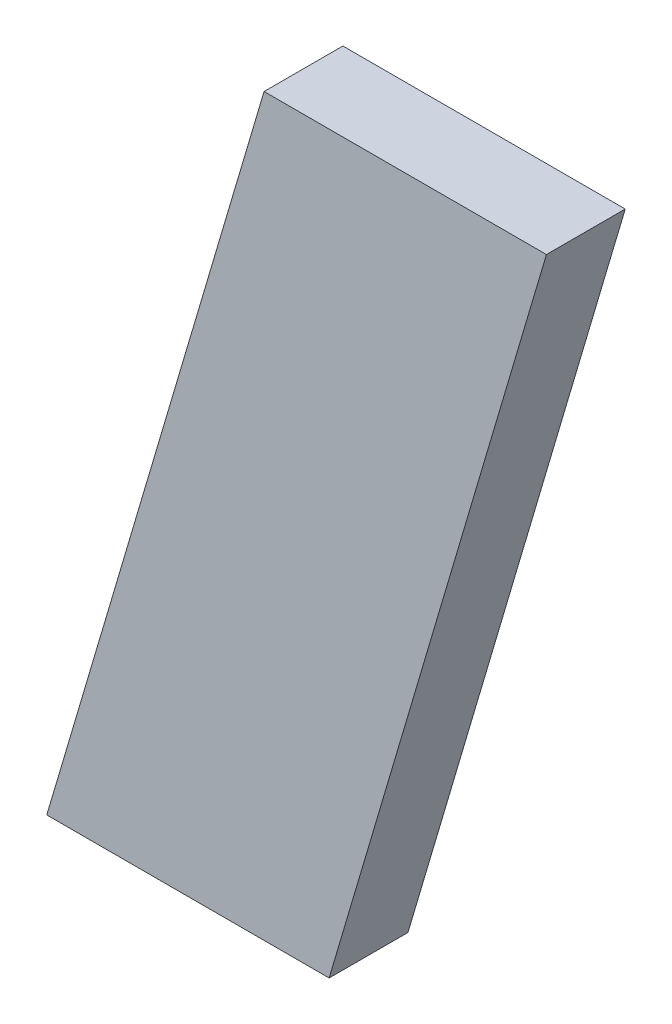
ISO-10303-21;
HEADER;
FILE_DESCRIPTION(('STEP AP214'),'2;1');
FILE_NAME('part.step','',(''),(''),'','','');
FILE_SCHEMA(('AUTOMOTIVE_DESIGN { 1 0 10303 214 1 1 1 1 }'));
ENDSEC;
DATA;
#1=APPLICATION_CONTEXT('core data for automotive mechanical design processes');
#2=APPLICATION_PROTOCOL_DEFINITION('international standard','automotive_design',2000,#1);
#3=PRODUCT_CONTEXT('',#1,'mechanical');
#4=PRODUCT('Part','Part','',(#3));
#5=PRODUCT_RELATED_PRODUCT_CATEGORY('part','',(#4));
#6=PRODUCT_DEFINITION_FORMATION('','',#4);
#7=PRODUCT_DEFINITION_CONTEXT('part definition',#1,'design');
#8=PRODUCT_DEFINITION('design','',#6,#7);
#9=PRODUCT_DEFINITION_SHAPE('','',#8);
#10=(LENGTH_UNIT() NAMED_UNIT(*) SI_UNIT(.MILLI.,.METRE.));
#11=(NAMED_UNIT(*) PLANE_ANGLE_UNIT() SI_UNIT($,.RADIAN.));
#12=(NAMED_UNIT(*) SI_UNIT($,.STERADIAN.) SOLID_ANGLE_UNIT());
#13=UNCERTAINTY_MEASURE_WITH_UNIT(LENGTH_MEASURE(1.E-05),#10,'distance_accuracy_value','');
#14=(GEOMETRIC_REPRESENTATION_CONTEXT(3) GLOBAL_UNCERTAINTY_ASSIGNED_CONTEXT((#13)) GLOBAL_UNIT_ASSIGNED_CONTEXT((#10,
#11,#12)) REPRESENTATION_CONTEXT('',''));
#15=CARTESIAN_POINT('',(0.,0.,0.));
#16=DIRECTION('',(0.,0.,1.));
#17=DIRECTION('',(1.,0.,0.));
#18=AXIS2_PLACEMENT_3D('',#15,#16,#17);
#19=CARTESIAN_POINT('',(-4.324026202271,-7.551976874295,0.));
#20=DIRECTION('',(0.,1.,0.));
#21=DIRECTION('',(-1.,0.,0.));
#22=AXIS2_PLACEMENT_3D('',#19,#20,#21);
#23=PLANE('',#22);
#24=DIRECTION('',(-1.,0.,0.));
#25=VECTOR('',#24,1.);
#26=CARTESIAN_POINT('',(-4.324026202271,-7.551976874295,0.));
#27=LINE('',#26,#25);
#28=CARTESIAN_POINT('',(-4.324026202271,-7.551976874295,0.));
#29=VERTEX_POINT('',#28);
#30=CARTESIAN_POINT('',(-4.682378611228,-7.551976874295,0.));
#31=VERTEX_POINT('',#30);
#32=EDGE_CURVE('E11',#29,#31,#27,.T.);
#33=ORIENTED_EDGE('',*,*,#32,.T.);
#34=DIRECTION('',(0.,0.,1.));
#35=VECTOR('',#34,1.);
#36=CARTESIAN_POINT('',(-4.682378611228,-7.551976874295,0.));
#37=LINE('',#36,#35);
#38=CARTESIAN_POINT('',(-4.682378611228,-7.551976874295,0.1));
#39=VERTEX_POINT('',#38);
#40=EDGE_CURVE('E24',#31,#39,#37,.T.);
#41=ORIENTED_EDGE('',*,*,#40,.T.);
#42=DIRECTION('',(-1.,0.,0.));
#43=VECTOR('',#42,1.);
#44=CARTESIAN_POINT('',(-4.324026202271,-7.551976874295,0.1));
#45=LINE('',#44,#43);
#46=CARTESIAN_POINT('',(-4.324026202271,-7.551976874295,0.1));
#47=VERTEX_POINT('',#46);
#48=EDGE_CURVE('E75',#47,#39,#45,.T.);
#49=ORIENTED_EDGE('',*,*,#48,.F.);
#50=DIRECTION('',(0.,0.,1.));
#51=VECTOR('',#50,1.);
#52=CARTESIAN_POINT('',(-4.324026202271,-7.551976874295,0.));
#53=LINE('',#52,#51);
#54=EDGE_CURVE('E86',#29,#47,#53,.T.);
#55=ORIENTED_EDGE('',*,*,#54,.F.);
#56=EDGE_LOOP('',(#33,#41,#49,#55));
#57=FACE_BOUND('',#56,.T.);
#58=ADVANCED_FACE('F17',(#57),#23,.T.);
#59=CARTESIAN_POINT('',(-4.599774339594,-8.484987758415,0.));
#60=DIRECTION('',(0.958993732012228,-0.283427278082509,0.));
#61=DIRECTION('',(0.283427278082509,0.958993732012228,0.));
#62=AXIS2_PLACEMENT_3D('',#59,#60,#61);
#63=PLANE('',#62);
#64=DIRECTION('',(0.283427278082509,0.958993732012228,0.));
#65=VECTOR('',#64,1.);
#66=CARTESIAN_POINT('',(-4.599774339594,-8.484987758415,0.));
#67=LINE('',#66,#65);
#68=CARTESIAN_POINT('',(-4.599774339594,-8.484987758415,0.));
#69=VERTEX_POINT('',#68);
#70=EDGE_CURVE('E83',#69,#29,#67,.T.);
#71=ORIENTED_EDGE('',*,*,#70,.T.);
#72=ORIENTED_EDGE('',*,*,#54,.T.);
#73=DIRECTION('',(0.283427278082509,0.958993732012228,0.));
#74=VECTOR('',#73,1.);
#75=CARTESIAN_POINT('',(-4.599774339594,-8.484987758415,0.1));
#76=LINE('',#75,#74);
#77=CARTESIAN_POINT('',(-4.599774339594,-8.484987758415,0.1));
#78=VERTEX_POINT('',#77);
#79=EDGE_CURVE('E81',#78,#47,#76,.T.);
#80=ORIENTED_EDGE('',*,*,#79,.F.);
#81=DIRECTION('',(0.,0.,1.));
#82=VECTOR('',#81,1.);
#83=CARTESIAN_POINT('',(-4.599774339594,-8.484987758415,0.));
#84=LINE('',#83,#82);
#85=EDGE_CURVE('E61',#69,#78,#84,.T.);
#86=ORIENTED_EDGE('',*,*,#85,.F.);
#87=EDGE_LOOP('',(#71,#72,#80,#86));
#88=FACE_BOUND('',#87,.T.);
#89=ADVANCED_FACE('F91',(#88),#63,.T.);
#90=CARTESIAN_POINT('',(-4.958126748551,-8.484987758415,0.));
#91=DIRECTION('',(0.,-1.,0.));
#92=DIRECTION('',(1.,0.,0.));
#93=AXIS2_PLACEMENT_3D('',#90,#91,#92);
#94=PLANE('',#93);
#95=DIRECTION('',(1.,0.,0.));
#96=VECTOR('',#95,1.);
#97=CARTESIAN_POINT('',(-4.958126748551,-8.484987758415,0.));
#98=LINE('',#97,#96);
#99=CARTESIAN_POINT('',(-4.958126748551,-8.484987758415,0.));
#100=VERTEX_POINT('',#99);
#101=EDGE_CURVE('E65',#100,#69,#98,.T.);
#102=ORIENTED_EDGE('',*,*,#101,.T.);
#103=ORIENTED_EDGE('',*,*,#85,.T.);
#104=DIRECTION('',(1.,0.,0.));
#105=VECTOR('',#104,1.);
#106=CARTESIAN_POINT('',(-4.958126748551,-8.484987758415,0.1));
#107=LINE('',#106,#105);
#108=CARTESIAN_POINT('',(-4.958126748551,-8.484987758415,0.1));
#109=VERTEX_POINT('',#108);
#110=EDGE_CURVE('E54',#109,#78,#107,.T.);
#111=ORIENTED_EDGE('',*,*,#110,.F.);
#112=DIRECTION('',(0.,0.,1.));
#113=VECTOR('',#112,1.);
#114=CARTESIAN_POINT('',(-4.958126748551,-8.484987758415,0.));
#115=LINE('',#114,#113);
#116=EDGE_CURVE('E58',#100,#109,#115,.T.);
#117=ORIENTED_EDGE('',*,*,#116,.F.);
#118=EDGE_LOOP('',(#102,#103,#111,#117));
#119=FACE_BOUND('',#118,.T.);
#120=ADVANCED_FACE('F57',(#119),#94,.T.);
#121=CARTESIAN_POINT('',(-4.682378611228,-7.551976874295,0.));
#122=DIRECTION('',(-0.958993732012227,0.28342727808251,0.));
#123=DIRECTION('',(-0.28342727808251,-0.958993732012227,0.));
#124=AXIS2_PLACEMENT_3D('',#121,#122,#123);
#125=PLANE('',#124);
#126=DIRECTION('',(-0.28342727808251,-0.958993732012227,0.));
#127=VECTOR('',#126,1.);
#128=CARTESIAN_POINT('',(-4.682378611228,-7.551976874295,0.));
#129=LINE('',#128,#127);
#130=EDGE_CURVE('E71',#31,#100,#129,.T.);
#131=ORIENTED_EDGE('',*,*,#130,.T.);
#132=ORIENTED_EDGE('',*,*,#116,.T.);
#133=DIRECTION('',(-0.28342727808251,-0.958993732012227,0.));
#134=VECTOR('',#133,1.);
#135=CARTESIAN_POINT('',(-4.682378611228,-7.551976874295,0.1));
#136=LINE('',#135,#134);
#137=EDGE_CURVE('E70',#39,#109,#136,.T.);
#138=ORIENTED_EDGE('',*,*,#137,.F.);
#139=ORIENTED_EDGE('',*,*,#40,.F.);
#140=EDGE_LOOP('',(#131,#132,#138,#139));
#141=FACE_BOUND('',#140,.T.);
#142=ADVANCED_FACE('F69',(#141),#125,.T.);
#143=CARTESIAN_POINT('',(-4.641076475411,-8.018482316355,0.1));
#144=DIRECTION('',(0.,0.,1.));
#145=DIRECTION('',(1.,0.,0.));
#146=AXIS2_PLACEMENT_3D('',#143,#144,#145);
#147=PLANE('',#146);
#148=ORIENTED_EDGE('',*,*,#137,.T.);
#149=ORIENTED_EDGE('',*,*,#110,.T.);
#150=ORIENTED_EDGE('',*,*,#79,.T.);
#151=ORIENTED_EDGE('',*,*,#48,.T.);
#152=EDGE_LOOP('',(#148,#149,#150,#151));
#153=FACE_BOUND('',#152,.T.);
#154=ADVANCED_FACE('F74',(#153),#147,.T.);
#155=CARTESIAN_POINT('',(-4.641076475411,-8.018482316355,0.));
#156=DIRECTION('',(0.,0.,1.));
#157=DIRECTION('',(1.,0.,0.));
#158=AXIS2_PLACEMENT_3D('',#155,#156,#157);
#159=PLANE('',#158);
#160=ORIENTED_EDGE('',*,*,#130,.F.);
#161=ORIENTED_EDGE('',*,*,#32,.F.);
#162=ORIENTED_EDGE('',*,*,#70,.F.);
#163=ORIENTED_EDGE('',*,*,#101,.F.);
#164=EDGE_LOOP('',(#160,#161,#162,#163));
#165=FACE_BOUND('',#164,.T.);
#166=ADVANCED_FACE('F89',(#165),#159,.F.);
#167=CLOSED_SHELL('',(#58,#89,#120,#142,#154,#166));
#168=MANIFOLD_SOLID_BREP('B1',#167);
#169=ADVANCED_BREP_SHAPE_REPRESENTATION('',(#18,#168),#14);
#170=SHAPE_DEFINITION_REPRESENTATION(#9,#169);
ENDSEC;
END-ISO-10303-21;
